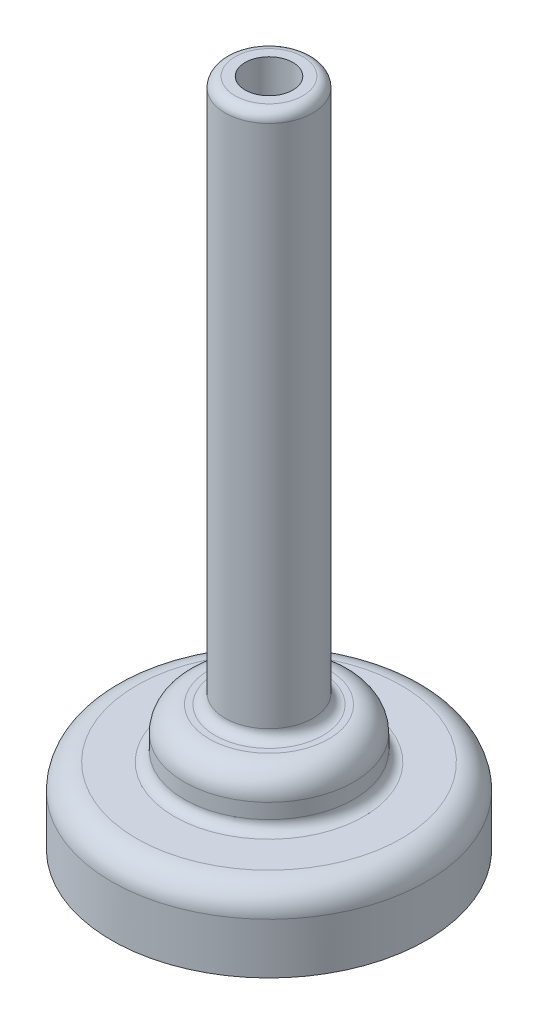
ISO-10303-21;
HEADER;
FILE_DESCRIPTION(('STEP AP214'),'2;1');
FILE_NAME('part.step','',(''),(''),'','','');
FILE_SCHEMA(('AUTOMOTIVE_DESIGN { 1 0 10303 214 1 1 1 1 }'));
ENDSEC;
DATA;
#1=APPLICATION_CONTEXT('core data for automotive mechanical design processes');
#2=APPLICATION_PROTOCOL_DEFINITION('international standard','automotive_design',2000,#1);
#3=PRODUCT_CONTEXT('',#1,'mechanical');
#4=PRODUCT('Part','Part','',(#3));
#5=PRODUCT_RELATED_PRODUCT_CATEGORY('part','',(#4));
#6=PRODUCT_DEFINITION_FORMATION('','',#4);
#7=PRODUCT_DEFINITION_CONTEXT('part definition',#1,'design');
#8=PRODUCT_DEFINITION('design','',#6,#7);
#9=PRODUCT_DEFINITION_SHAPE('','',#8);
#10=(LENGTH_UNIT() NAMED_UNIT(*) SI_UNIT(.MILLI.,.METRE.));
#11=(NAMED_UNIT(*) PLANE_ANGLE_UNIT() SI_UNIT($,.RADIAN.));
#12=(NAMED_UNIT(*) SI_UNIT($,.STERADIAN.) SOLID_ANGLE_UNIT());
#13=UNCERTAINTY_MEASURE_WITH_UNIT(LENGTH_MEASURE(1.E-05),#10,'distance_accuracy_value','');
#14=(GEOMETRIC_REPRESENTATION_CONTEXT(3) GLOBAL_UNCERTAINTY_ASSIGNED_CONTEXT((#13)) GLOBAL_UNIT_ASSIGNED_CONTEXT((#10,
#11,#12)) REPRESENTATION_CONTEXT('',''));
#15=CARTESIAN_POINT('',(0.,0.,0.));
#16=DIRECTION('',(0.,0.,1.));
#17=DIRECTION('',(1.,0.,0.));
#18=AXIS2_PLACEMENT_3D('',#15,#16,#17);
#19=CARTESIAN_POINT('',(-10.033,3.556,0.));
#20=DIRECTION('',(0.,1.,0.));
#21=DIRECTION('',(0.,0.,1.));
#22=AXIS2_PLACEMENT_3D('',#19,#20,#21);
#23=PLANE('',#22);
#24=CARTESIAN_POINT('',(0.,3.556,0.));
#25=DIRECTION('',(0.,1.,0.));
#26=DIRECTION('',(0.,0.,1.));
#27=AXIS2_PLACEMENT_3D('',#24,#25,#26);
#28=CIRCLE('',#27,4.7625);
#29=CARTESIAN_POINT('',(0.,3.556,4.7625));
#30=VERTEX_POINT('',#29);
#31=EDGE_CURVE('E41',#30,#30,#28,.T.);
#32=ORIENTED_EDGE('',*,*,#31,.T.);
#33=EDGE_LOOP('',(#32));
#34=FACE_BOUND('',#33,.T.);
#35=CARTESIAN_POINT('',(0.,3.556,0.));
#36=DIRECTION('',(0.,1.,0.));
#37=DIRECTION('',(0.,0.,1.));
#38=AXIS2_PLACEMENT_3D('',#35,#36,#37);
#39=CIRCLE('',#38,7.62);
#40=CARTESIAN_POINT('',(0.,3.556,7.62));
#41=VERTEX_POINT('',#40);
#42=EDGE_CURVE('E45',#41,#41,#39,.F.);
#43=ORIENTED_EDGE('',*,*,#42,.T.);
#44=EDGE_LOOP('',(#43));
#45=FACE_BOUND('',#44,.T.);
#46=ADVANCED_FACE('F30',(#34,#45),#23,.F.);
#47=CARTESIAN_POINT('',(-2.794,42.672,0.));
#48=DIRECTION('',(0.,1.,0.));
#49=DIRECTION('',(0.,0.,1.));
#50=AXIS2_PLACEMENT_3D('',#47,#48,#49);
#51=PLANE('',#50);
#52=CARTESIAN_POINT('',(0.,42.672,0.));
#53=DIRECTION('',(0.,1.,0.));
#54=DIRECTION('',(0.,0.,1.));
#55=AXIS2_PLACEMENT_3D('',#52,#53,#54);
#56=CIRCLE('',#55,2.159);
#57=CARTESIAN_POINT('',(0.,42.672,2.159));
#58=VERTEX_POINT('',#57);
#59=EDGE_CURVE('E10',#58,#58,#56,.T.);
#60=ORIENTED_EDGE('',*,*,#59,.T.);
#61=EDGE_LOOP('',(#60));
#62=FACE_BOUND('',#61,.T.);
#63=CARTESIAN_POINT('',(0.,42.672,0.));
#64=DIRECTION('',(0.,1.,0.));
#65=DIRECTION('',(0.,0.,1.));
#66=AXIS2_PLACEMENT_3D('',#63,#64,#65);
#67=CIRCLE('',#66,1.524);
#68=CARTESIAN_POINT('',(0.,42.672,1.524));
#69=VERTEX_POINT('',#68);
#70=EDGE_CURVE('E90',#69,#69,#67,.F.);
#71=ORIENTED_EDGE('',*,*,#70,.T.);
#72=EDGE_LOOP('',(#71));
#73=FACE_BOUND('',#72,.T.);
#74=ADVANCED_FACE('F122',(#62,#73),#51,.T.);
#75=CARTESIAN_POINT('',(0.,0.,0.));
#76=DIRECTION('',(0.,-1.,0.));
#77=DIRECTION('',(0.,0.,-1.));
#78=AXIS2_PLACEMENT_3D('',#75,#76,#77);
#79=CYLINDRICAL_SURFACE('',#78,2.794);
#80=CARTESIAN_POINT('',(0.,8.636,0.));
#81=DIRECTION('',(0.,1.,0.));
#82=DIRECTION('',(0.,0.,1.));
#83=AXIS2_PLACEMENT_3D('',#80,#81,#82);
#84=CIRCLE('',#83,2.794);
#85=CARTESIAN_POINT('',(0.,8.636,2.794));
#86=VERTEX_POINT('',#85);
#87=EDGE_CURVE('E65',#86,#86,#84,.T.);
#88=ORIENTED_EDGE('',*,*,#87,.T.);
#89=EDGE_LOOP('',(#88));
#90=FACE_BOUND('',#89,.T.);
#91=CARTESIAN_POINT('',(0.,42.037,0.));
#92=DIRECTION('',(0.,1.,0.));
#93=DIRECTION('',(0.,0.,1.));
#94=AXIS2_PLACEMENT_3D('',#91,#92,#93);
#95=CIRCLE('',#94,2.794);
#96=CARTESIAN_POINT('',(0.,42.037,2.794));
#97=VERTEX_POINT('',#96);
#98=EDGE_CURVE('E68',#97,#97,#95,.F.);
#99=ORIENTED_EDGE('',*,*,#98,.T.);
#100=EDGE_LOOP('',(#99));
#101=FACE_BOUND('',#100,.T.);
#102=ADVANCED_FACE('F128',(#90,#101),#79,.T.);
#103=CARTESIAN_POINT('',(-5.3975,8.001,0.));
#104=DIRECTION('',(0.,1.,0.));
#105=DIRECTION('',(0.,0.,1.));
#106=AXIS2_PLACEMENT_3D('',#103,#104,#105);
#107=PLANE('',#106);
#108=CARTESIAN_POINT('',(0.,8.001,0.));
#109=DIRECTION('',(0.,1.,0.));
#110=DIRECTION('',(0.,0.,1.));
#111=AXIS2_PLACEMENT_3D('',#108,#109,#110);
#112=CIRCLE('',#111,3.429);
#113=CARTESIAN_POINT('',(0.,8.001,3.429));
#114=VERTEX_POINT('',#113);
#115=EDGE_CURVE('E71',#114,#114,#112,.F.);
#116=ORIENTED_EDGE('',*,*,#115,.T.);
#117=EDGE_LOOP('',(#116));
#118=FACE_BOUND('',#117,.T.);
#119=CARTESIAN_POINT('',(0.,8.001,0.));
#120=DIRECTION('',(0.,1.,0.));
#121=DIRECTION('',(0.,0.,1.));
#122=AXIS2_PLACEMENT_3D('',#119,#120,#121);
#123=CIRCLE('',#122,3.81);
#124=CARTESIAN_POINT('',(0.,8.001,3.81));
#125=VERTEX_POINT('',#124);
#126=EDGE_CURVE('E74',#125,#125,#123,.T.);
#127=ORIENTED_EDGE('',*,*,#126,.T.);
#128=EDGE_LOOP('',(#127));
#129=FACE_BOUND('',#128,.T.);
#130=ADVANCED_FACE('F194',(#118,#129),#107,.T.);
#131=CARTESIAN_POINT('',(0.,0.,0.));
#132=DIRECTION('',(0.,-1.,0.));
#133=DIRECTION('',(0.,0.,-1.));
#134=AXIS2_PLACEMENT_3D('',#131,#132,#133);
#135=CYLINDRICAL_SURFACE('',#134,5.3975);
#136=CARTESIAN_POINT('',(0.,5.461,0.));
#137=DIRECTION('',(0.,1.,0.));
#138=DIRECTION('',(0.,0.,1.));
#139=AXIS2_PLACEMENT_3D('',#136,#137,#138);
#140=CIRCLE('',#139,5.3975);
#141=CARTESIAN_POINT('',(0.,5.461,5.3975));
#142=VERTEX_POINT('',#141);
#143=EDGE_CURVE('E59',#142,#142,#140,.T.);
#144=ORIENTED_EDGE('',*,*,#143,.T.);
#145=EDGE_LOOP('',(#144));
#146=FACE_BOUND('',#145,.T.);
#147=CARTESIAN_POINT('',(0.,6.4135,0.));
#148=DIRECTION('',(0.,1.,0.));
#149=DIRECTION('',(0.,0.,1.));
#150=AXIS2_PLACEMENT_3D('',#147,#148,#149);
#151=CIRCLE('',#150,5.3975);
#152=CARTESIAN_POINT('',(0.,6.4135,5.3975));
#153=VERTEX_POINT('',#152);
#154=EDGE_CURVE('E77',#153,#153,#151,.F.);
#155=ORIENTED_EDGE('',*,*,#154,.T.);
#156=EDGE_LOOP('',(#155));
#157=FACE_BOUND('',#156,.T.);
#158=ADVANCED_FACE('F200',(#146,#157),#135,.T.);
#159=CARTESIAN_POINT('',(-10.033,4.826,0.));
#160=DIRECTION('',(0.,1.,0.));
#161=DIRECTION('',(0.,0.,1.));
#162=AXIS2_PLACEMENT_3D('',#159,#160,#161);
#163=PLANE('',#162);
#164=CARTESIAN_POINT('',(0.,4.826,0.));
#165=DIRECTION('',(0.,1.,0.));
#166=DIRECTION('',(0.,0.,1.));
#167=AXIS2_PLACEMENT_3D('',#164,#165,#166);
#168=CIRCLE('',#167,6.0325);
#169=CARTESIAN_POINT('',(0.,4.826,6.0325));
#170=VERTEX_POINT('',#169);
#171=EDGE_CURVE('E62',#170,#170,#168,.F.);
#172=ORIENTED_EDGE('',*,*,#171,.T.);
#173=EDGE_LOOP('',(#172));
#174=FACE_BOUND('',#173,.T.);
#175=CARTESIAN_POINT('',(0.,4.826,0.));
#176=DIRECTION('',(0.,1.,0.));
#177=DIRECTION('',(0.,0.,1.));
#178=AXIS2_PLACEMENT_3D('',#175,#176,#177);
#179=CIRCLE('',#178,8.4455);
#180=CARTESIAN_POINT('',(0.,4.826,8.4455));
#181=VERTEX_POINT('',#180);
#182=EDGE_CURVE('E80',#181,#181,#179,.T.);
#183=ORIENTED_EDGE('',*,*,#182,.T.);
#184=EDGE_LOOP('',(#183));
#185=FACE_BOUND('',#184,.T.);
#186=ADVANCED_FACE('F117',(#174,#185),#163,.T.);
#187=CARTESIAN_POINT('',(0.,0.,0.));
#188=DIRECTION('',(0.,-1.,0.));
#189=DIRECTION('',(0.,0.,-1.));
#190=AXIS2_PLACEMENT_3D('',#187,#188,#189);
#191=CYLINDRICAL_SURFACE('',#190,10.033);
#192=CARTESIAN_POINT('',(0.,3.2385,0.));
#193=DIRECTION('',(0.,1.,0.));
#194=DIRECTION('',(0.,0.,1.));
#195=AXIS2_PLACEMENT_3D('',#192,#193,#194);
#196=CIRCLE('',#195,10.033);
#197=CARTESIAN_POINT('',(0.,3.2385,10.033));
#198=VERTEX_POINT('',#197);
#199=EDGE_CURVE('E83',#198,#198,#196,.F.);
#200=ORIENTED_EDGE('',*,*,#199,.T.);
#201=EDGE_LOOP('',(#200));
#202=FACE_BOUND('',#201,.T.);
#203=CARTESIAN_POINT('',(0.,0.,0.));
#204=DIRECTION('',(0.,-1.,0.));
#205=DIRECTION('',(0.,0.,-1.));
#206=AXIS2_PLACEMENT_3D('',#203,#204,#205);
#207=CIRCLE('',#206,10.033);
#208=CARTESIAN_POINT('',(0.,0.,-10.033));
#209=VERTEX_POINT('',#208);
#210=EDGE_CURVE('E86',#209,#209,#207,.T.);
#211=ORIENTED_EDGE('',*,*,#210,.F.);
#212=EDGE_LOOP('',(#211));
#213=FACE_BOUND('',#212,.T.);
#214=ADVANCED_FACE('F107',(#202,#213),#191,.T.);
#215=CARTESIAN_POINT('',(0.,0.,0.));
#216=DIRECTION('',(0.,-1.,0.));
#217=DIRECTION('',(0.,0.,-1.));
#218=AXIS2_PLACEMENT_3D('',#215,#216,#217);
#219=PLANE('',#218);
#220=ORIENTED_EDGE('',*,*,#210,.T.);
#221=EDGE_LOOP('',(#220));
#222=FACE_BOUND('',#221,.T.);
#223=CARTESIAN_POINT('',(0.,0.,0.));
#224=DIRECTION('',(0.,-1.,0.));
#225=DIRECTION('',(0.,0.,-1.));
#226=AXIS2_PLACEMENT_3D('',#223,#224,#225);
#227=CIRCLE('',#226,8.255);
#228=CARTESIAN_POINT('',(0.,0.,-8.255));
#229=VERTEX_POINT('',#228);
#230=EDGE_CURVE('E94',#229,#229,#227,.T.);
#231=ORIENTED_EDGE('',*,*,#230,.F.);
#232=EDGE_LOOP('',(#231));
#233=FACE_BOUND('',#232,.T.);
#234=ADVANCED_FACE('F104',(#222,#233),#219,.T.);
#235=CARTESIAN_POINT('',(0.,3.2385,0.));
#236=DIRECTION('',(0.,1.,0.));
#237=DIRECTION('',(0.,0.,1.));
#238=AXIS2_PLACEMENT_3D('',#235,#236,#237);
#239=TOROIDAL_SURFACE('',#238,8.4455,1.5875);
#240=ORIENTED_EDGE('',*,*,#182,.F.);
#241=EDGE_LOOP('',(#240));
#242=FACE_BOUND('',#241,.T.);
#243=ORIENTED_EDGE('',*,*,#199,.F.);
#244=EDGE_LOOP('',(#243));
#245=FACE_BOUND('',#244,.T.);
#246=ADVANCED_FACE('F106',(#242,#245),#239,.T.);
#247=CARTESIAN_POINT('',(0.,6.4135,0.));
#248=DIRECTION('',(0.,1.,0.));
#249=DIRECTION('',(0.,0.,1.));
#250=AXIS2_PLACEMENT_3D('',#247,#248,#249);
#251=TOROIDAL_SURFACE('',#250,3.81,1.5875);
#252=ORIENTED_EDGE('',*,*,#126,.F.);
#253=EDGE_LOOP('',(#252));
#254=FACE_BOUND('',#253,.T.);
#255=ORIENTED_EDGE('',*,*,#154,.F.);
#256=EDGE_LOOP('',(#255));
#257=FACE_BOUND('',#256,.T.);
#258=ADVANCED_FACE('F114',(#254,#257),#251,.T.);
#259=CARTESIAN_POINT('',(0.,0.,0.));
#260=DIRECTION('',(0.,-1.,0.));
#261=DIRECTION('',(0.,0.,-1.));
#262=AXIS2_PLACEMENT_3D('',#259,#260,#261);
#263=CYLINDRICAL_SURFACE('',#262,1.524);
#264=CARTESIAN_POINT('',(0.,7.366,0.));
#265=DIRECTION('',(0.,1.,0.));
#266=DIRECTION('',(0.,0.,1.));
#267=AXIS2_PLACEMENT_3D('',#264,#265,#266);
#268=CIRCLE('',#267,1.524);
#269=CARTESIAN_POINT('',(0.,7.366,1.524));
#270=VERTEX_POINT('',#269);
#271=EDGE_CURVE('E56',#270,#270,#268,.F.);
#272=ORIENTED_EDGE('',*,*,#271,.T.);
#273=EDGE_LOOP('',(#272));
#274=FACE_BOUND('',#273,.T.);
#275=ORIENTED_EDGE('',*,*,#70,.F.);
#276=EDGE_LOOP('',(#275));
#277=FACE_BOUND('',#276,.T.);
#278=ADVANCED_FACE('F151',(#274,#277),#263,.F.);
#279=CARTESIAN_POINT('',(-5.3975,6.731,0.));
#280=DIRECTION('',(0.,1.,0.));
#281=DIRECTION('',(0.,0.,1.));
#282=AXIS2_PLACEMENT_3D('',#279,#280,#281);
#283=PLANE('',#282);
#284=CARTESIAN_POINT('',(0.,6.731,0.));
#285=DIRECTION('',(0.,1.,0.));
#286=DIRECTION('',(0.,0.,1.));
#287=AXIS2_PLACEMENT_3D('',#284,#285,#286);
#288=CIRCLE('',#287,2.159);
#289=CARTESIAN_POINT('',(0.,6.731,2.159));
#290=VERTEX_POINT('',#289);
#291=EDGE_CURVE('E53',#290,#290,#288,.T.);
#292=ORIENTED_EDGE('',*,*,#291,.T.);
#293=EDGE_LOOP('',(#292));
#294=FACE_BOUND('',#293,.T.);
#295=CARTESIAN_POINT('',(0.,6.731,0.));
#296=DIRECTION('',(0.,1.,0.));
#297=DIRECTION('',(0.,0.,1.));
#298=AXIS2_PLACEMENT_3D('',#295,#296,#297);
#299=CIRCLE('',#298,3.81);
#300=CARTESIAN_POINT('',(0.,6.731,3.81));
#301=VERTEX_POINT('',#300);
#302=EDGE_CURVE('E89',#301,#301,#299,.T.);
#303=ORIENTED_EDGE('',*,*,#302,.F.);
#304=EDGE_LOOP('',(#303));
#305=FACE_BOUND('',#304,.T.);
#306=ADVANCED_FACE('F143',(#294,#305),#283,.F.);
#307=CARTESIAN_POINT('',(0.,0.,0.));
#308=DIRECTION('',(0.,-1.,0.));
#309=DIRECTION('',(0.,0.,-1.));
#310=AXIS2_PLACEMENT_3D('',#307,#308,#309);
#311=CYLINDRICAL_SURFACE('',#310,4.1275);
#312=CARTESIAN_POINT('',(0.,4.191,0.));
#313=DIRECTION('',(0.,1.,0.));
#314=DIRECTION('',(0.,0.,1.));
#315=AXIS2_PLACEMENT_3D('',#312,#313,#314);
#316=CIRCLE('',#315,4.1275);
#317=CARTESIAN_POINT('',(0.,4.191,4.1275));
#318=VERTEX_POINT('',#317);
#319=EDGE_CURVE('E50',#318,#318,#316,.F.);
#320=ORIENTED_EDGE('',*,*,#319,.T.);
#321=EDGE_LOOP('',(#320));
#322=FACE_BOUND('',#321,.T.);
#323=CARTESIAN_POINT('',(0.,6.4135,0.));
#324=DIRECTION('',(0.,-1.,0.));
#325=DIRECTION('',(0.,0.,-1.));
#326=AXIS2_PLACEMENT_3D('',#323,#324,#325);
#327=CIRCLE('',#326,4.1275);
#328=CARTESIAN_POINT('',(0.,6.4135,-4.1275));
#329=VERTEX_POINT('',#328);
#330=EDGE_CURVE('E93',#329,#329,#327,.T.);
#331=ORIENTED_EDGE('',*,*,#330,.F.);
#332=EDGE_LOOP('',(#331));
#333=FACE_BOUND('',#332,.T.);
#334=ADVANCED_FACE('F132',(#322,#333),#311,.F.);
#335=CARTESIAN_POINT('',(0.,6.4135,0.));
#336=DIRECTION('',(0.,1.,0.));
#337=DIRECTION('',(0.,0.,1.));
#338=AXIS2_PLACEMENT_3D('',#335,#336,#337);
#339=TOROIDAL_SURFACE('',#338,3.81,0.3175);
#340=ORIENTED_EDGE('',*,*,#302,.T.);
#341=EDGE_LOOP('',(#340));
#342=FACE_BOUND('',#341,.T.);
#343=ORIENTED_EDGE('',*,*,#330,.T.);
#344=EDGE_LOOP('',(#343));
#345=FACE_BOUND('',#344,.T.);
#346=ADVANCED_FACE('F134',(#342,#345),#339,.F.);
#347=CARTESIAN_POINT('',(0.,28.3415068941509,0.));
#348=DIRECTION('',(0.,-1.,0.));
#349=DIRECTION('',(0.,0.,-1.));
#350=AXIS2_PLACEMENT_3D('',#347,#348,#349);
#351=CYLINDRICAL_SURFACE('',#350,8.255);
#352=CARTESIAN_POINT('',(0.,2.921,0.));
#353=DIRECTION('',(0.,1.,0.));
#354=DIRECTION('',(0.,0.,1.));
#355=AXIS2_PLACEMENT_3D('',#352,#353,#354);
#356=CIRCLE('',#355,8.255);
#357=CARTESIAN_POINT('',(0.,2.921,8.255));
#358=VERTEX_POINT('',#357);
#359=EDGE_CURVE('E37',#358,#358,#356,.T.);
#360=ORIENTED_EDGE('',*,*,#359,.T.);
#361=EDGE_LOOP('',(#360));
#362=FACE_BOUND('',#361,.T.);
#363=ORIENTED_EDGE('',*,*,#230,.T.);
#364=EDGE_LOOP('',(#363));
#365=FACE_BOUND('',#364,.T.);
#366=ADVANCED_FACE('F102',(#362,#365),#351,.F.);
#367=CARTESIAN_POINT('',(0.,8.636,0.));
#368=DIRECTION('',(0.,1.,0.));
#369=DIRECTION('',(0.,0.,1.));
#370=AXIS2_PLACEMENT_3D('',#367,#368,#369);
#371=TOROIDAL_SURFACE('',#370,3.429,0.635);
#372=ORIENTED_EDGE('',*,*,#87,.F.);
#373=EDGE_LOOP('',(#372));
#374=FACE_BOUND('',#373,.T.);
#375=ORIENTED_EDGE('',*,*,#115,.F.);
#376=EDGE_LOOP('',(#375));
#377=FACE_BOUND('',#376,.T.);
#378=ADVANCED_FACE('F141',(#374,#377),#371,.F.);
#379=CARTESIAN_POINT('',(0.,5.461,0.));
#380=DIRECTION('',(0.,1.,0.));
#381=DIRECTION('',(0.,0.,1.));
#382=AXIS2_PLACEMENT_3D('',#379,#380,#381);
#383=TOROIDAL_SURFACE('',#382,6.0325,0.635);
#384=ORIENTED_EDGE('',*,*,#143,.F.);
#385=EDGE_LOOP('',(#384));
#386=FACE_BOUND('',#385,.T.);
#387=ORIENTED_EDGE('',*,*,#171,.F.);
#388=EDGE_LOOP('',(#387));
#389=FACE_BOUND('',#388,.T.);
#390=ADVANCED_FACE('F164',(#386,#389),#383,.F.);
#391=CARTESIAN_POINT('',(0.,7.366,0.));
#392=DIRECTION('',(0.,1.,0.));
#393=DIRECTION('',(0.,0.,1.));
#394=AXIS2_PLACEMENT_3D('',#391,#392,#393);
#395=TOROIDAL_SURFACE('',#394,2.159,0.635);
#396=ORIENTED_EDGE('',*,*,#291,.F.);
#397=EDGE_LOOP('',(#396));
#398=FACE_BOUND('',#397,.T.);
#399=ORIENTED_EDGE('',*,*,#271,.F.);
#400=EDGE_LOOP('',(#399));
#401=FACE_BOUND('',#400,.T.);
#402=ADVANCED_FACE('F160',(#398,#401),#395,.T.);
#403=CARTESIAN_POINT('',(0.,4.191,0.));
#404=DIRECTION('',(0.,1.,0.));
#405=DIRECTION('',(0.,0.,1.));
#406=AXIS2_PLACEMENT_3D('',#403,#404,#405);
#407=TOROIDAL_SURFACE('',#406,4.7625,0.635);
#408=ORIENTED_EDGE('',*,*,#31,.F.);
#409=EDGE_LOOP('',(#408));
#410=FACE_BOUND('',#409,.T.);
#411=ORIENTED_EDGE('',*,*,#319,.F.);
#412=EDGE_LOOP('',(#411));
#413=FACE_BOUND('',#412,.T.);
#414=ADVANCED_FACE('F163',(#410,#413),#407,.T.);
#415=CARTESIAN_POINT('',(0.,2.921,0.));
#416=DIRECTION('',(0.,1.,0.));
#417=DIRECTION('',(0.,0.,1.));
#418=AXIS2_PLACEMENT_3D('',#415,#416,#417);
#419=TOROIDAL_SURFACE('',#418,7.62,0.635);
#420=ORIENTED_EDGE('',*,*,#42,.F.);
#421=EDGE_LOOP('',(#420));
#422=FACE_BOUND('',#421,.T.);
#423=ORIENTED_EDGE('',*,*,#359,.F.);
#424=EDGE_LOOP('',(#423));
#425=FACE_BOUND('',#424,.T.);
#426=ADVANCED_FACE('F174',(#422,#425),#419,.F.);
#427=CARTESIAN_POINT('',(0.,42.037,0.));
#428=DIRECTION('',(0.,1.,0.));
#429=DIRECTION('',(0.,0.,1.));
#430=AXIS2_PLACEMENT_3D('',#427,#428,#429);
#431=TOROIDAL_SURFACE('',#430,2.159,0.635);
#432=ORIENTED_EDGE('',*,*,#59,.F.);
#433=EDGE_LOOP('',(#432));
#434=FACE_BOUND('',#433,.T.);
#435=ORIENTED_EDGE('',*,*,#98,.F.);
#436=EDGE_LOOP('',(#435));
#437=FACE_BOUND('',#436,.T.);
#438=ADVANCED_FACE('F32',(#434,#437),#431,.T.);
#439=CLOSED_SHELL('',(#46,#74,#102,#130,#158,#186,#214,#234,#246,#258,#278,#306,#334,#346,#366,
#378,#390,#402,#414,#426,#438));
#440=MANIFOLD_SOLID_BREP('B2',#439);
#441=ADVANCED_BREP_SHAPE_REPRESENTATION('',(#18,#440),#14);
#442=SHAPE_DEFINITION_REPRESENTATION(#9,#441);
ENDSEC;
END-ISO-10303-21;
